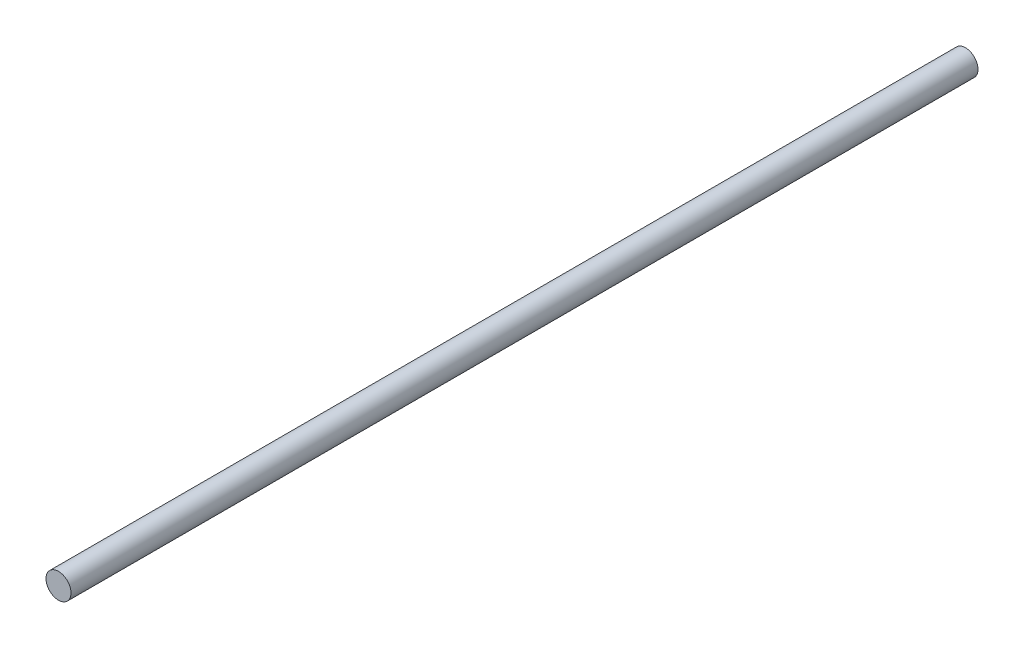
ISO-10303-21;
HEADER;
FILE_DESCRIPTION(('STEP AP214'),'2;1');
FILE_NAME('part.step','',(''),(''),'','','');
FILE_SCHEMA(('AUTOMOTIVE_DESIGN { 1 0 10303 214 1 1 1 1 }'));
ENDSEC;
DATA;
#1=APPLICATION_CONTEXT('core data for automotive mechanical design processes');
#2=APPLICATION_PROTOCOL_DEFINITION('international standard','automotive_design',2000,#1);
#3=PRODUCT_CONTEXT('',#1,'mechanical');
#4=PRODUCT('Part','Part','',(#3));
#5=PRODUCT_RELATED_PRODUCT_CATEGORY('part','',(#4));
#6=PRODUCT_DEFINITION_FORMATION('','',#4);
#7=PRODUCT_DEFINITION_CONTEXT('part definition',#1,'design');
#8=PRODUCT_DEFINITION('design','',#6,#7);
#9=PRODUCT_DEFINITION_SHAPE('','',#8);
#10=(LENGTH_UNIT() NAMED_UNIT(*) SI_UNIT(.MILLI.,.METRE.));
#11=(NAMED_UNIT(*) PLANE_ANGLE_UNIT() SI_UNIT($,.RADIAN.));
#12=(NAMED_UNIT(*) SI_UNIT($,.STERADIAN.) SOLID_ANGLE_UNIT());
#13=UNCERTAINTY_MEASURE_WITH_UNIT(LENGTH_MEASURE(1.E-05),#10,'distance_accuracy_value','');
#14=(GEOMETRIC_REPRESENTATION_CONTEXT(3) GLOBAL_UNCERTAINTY_ASSIGNED_CONTEXT((#13)) GLOBAL_UNIT_ASSIGNED_CONTEXT((#10,
#11,#12)) REPRESENTATION_CONTEXT('',''));
#15=CARTESIAN_POINT('',(0.,0.,0.));
#16=DIRECTION('',(0.,0.,1.));
#17=DIRECTION('',(1.,0.,0.));
#18=AXIS2_PLACEMENT_3D('',#15,#16,#17);
#19=CARTESIAN_POINT('',(0.,0.,127.));
#20=DIRECTION('',(0.,0.,-1.));
#21=DIRECTION('',(-1.,0.,0.));
#22=AXIS2_PLACEMENT_3D('',#19,#20,#21);
#23=CYLINDRICAL_SURFACE('',#22,1.7526);
#24=CARTESIAN_POINT('',(0.,0.,127.));
#25=DIRECTION('',(0.,0.,1.));
#26=DIRECTION('',(1.,0.,0.));
#27=AXIS2_PLACEMENT_3D('',#24,#25,#26);
#28=CIRCLE('',#27,1.7526);
#29=CARTESIAN_POINT('',(1.7526,0.,127.));
#30=VERTEX_POINT('',#29);
#31=EDGE_CURVE('E10',#30,#30,#28,.T.);
#32=ORIENTED_EDGE('',*,*,#31,.F.);
#33=EDGE_LOOP('',(#32));
#34=FACE_BOUND('',#33,.T.);
#35=CARTESIAN_POINT('',(0.,0.,0.));
#36=DIRECTION('',(0.,0.,1.));
#37=DIRECTION('',(1.,0.,0.));
#38=AXIS2_PLACEMENT_3D('',#35,#36,#37);
#39=CIRCLE('',#38,1.7526);
#40=CARTESIAN_POINT('',(1.7526,0.,0.));
#41=VERTEX_POINT('',#40);
#42=EDGE_CURVE('E36',#41,#41,#39,.T.);
#43=ORIENTED_EDGE('',*,*,#42,.T.);
#44=EDGE_LOOP('',(#43));
#45=FACE_BOUND('',#44,.T.);
#46=ADVANCED_FACE('F33',(#34,#45),#23,.T.);
#47=CARTESIAN_POINT('',(0.,0.,127.));
#48=DIRECTION('',(0.,0.,1.));
#49=DIRECTION('',(1.,0.,0.));
#50=AXIS2_PLACEMENT_3D('',#47,#48,#49);
#51=PLANE('',#50);
#52=ORIENTED_EDGE('',*,*,#31,.T.);
#53=EDGE_LOOP('',(#52));
#54=FACE_BOUND('',#53,.T.);
#55=ADVANCED_FACE('F48',(#54),#51,.T.);
#56=CARTESIAN_POINT('',(0.,0.,0.));
#57=DIRECTION('',(0.,0.,1.));
#58=DIRECTION('',(1.,0.,0.));
#59=AXIS2_PLACEMENT_3D('',#56,#57,#58);
#60=PLANE('',#59);
#61=ORIENTED_EDGE('',*,*,#42,.F.);
#62=EDGE_LOOP('',(#61));
#63=FACE_BOUND('',#62,.T.);
#64=ADVANCED_FACE('F46',(#63),#60,.F.);
#65=CLOSED_SHELL('',(#46,#55,#64));
#66=MANIFOLD_SOLID_BREP('B2',#65);
#67=ADVANCED_BREP_SHAPE_REPRESENTATION('',(#18,#66),#14);
#68=SHAPE_DEFINITION_REPRESENTATION(#9,#67);
ENDSEC;
END-ISO-10303-21;
